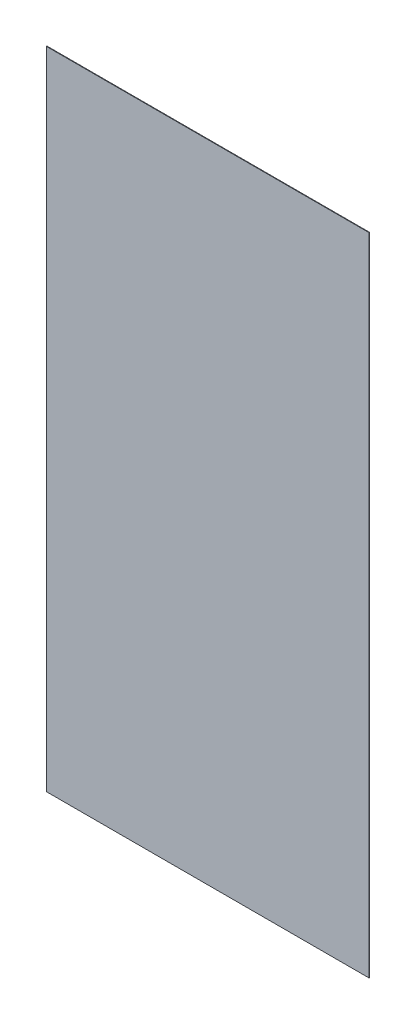
ISO-10303-21;
HEADER;
FILE_DESCRIPTION(('STEP AP214'),'2;1');
FILE_NAME('part.step','',(''),(''),'','','');
FILE_SCHEMA(('AUTOMOTIVE_DESIGN { 1 0 10303 214 1 1 1 1 }'));
ENDSEC;
DATA;
#1=APPLICATION_CONTEXT('core data for automotive mechanical design processes');
#2=APPLICATION_PROTOCOL_DEFINITION('international standard','automotive_design',2000,#1);
#3=PRODUCT_CONTEXT('',#1,'mechanical');
#4=PRODUCT('Part','Part','',(#3));
#5=PRODUCT_RELATED_PRODUCT_CATEGORY('part','',(#4));
#6=PRODUCT_DEFINITION_FORMATION('','',#4);
#7=PRODUCT_DEFINITION_CONTEXT('part definition',#1,'design');
#8=PRODUCT_DEFINITION('design','',#6,#7);
#9=PRODUCT_DEFINITION_SHAPE('','',#8);
#10=(LENGTH_UNIT() NAMED_UNIT(*) SI_UNIT(.MILLI.,.METRE.));
#11=(NAMED_UNIT(*) PLANE_ANGLE_UNIT() SI_UNIT($,.RADIAN.));
#12=(NAMED_UNIT(*) SI_UNIT($,.STERADIAN.) SOLID_ANGLE_UNIT());
#13=UNCERTAINTY_MEASURE_WITH_UNIT(LENGTH_MEASURE(1.E-05),#10,'distance_accuracy_value','');
#14=(GEOMETRIC_REPRESENTATION_CONTEXT(3) GLOBAL_UNCERTAINTY_ASSIGNED_CONTEXT((#13)) GLOBAL_UNIT_ASSIGNED_CONTEXT((#10,
#11,#12)) REPRESENTATION_CONTEXT('',''));
#15=CARTESIAN_POINT('',(0.,0.,0.));
#16=DIRECTION('',(0.,0.,1.));
#17=DIRECTION('',(1.,0.,0.));
#18=AXIS2_PLACEMENT_3D('',#15,#16,#17);
#19=CARTESIAN_POINT('',(0.,0.,1.5875));
#20=DIRECTION('',(1.,0.,0.));
#21=DIRECTION('',(0.,1.,0.));
#22=AXIS2_PLACEMENT_3D('',#19,#20,#21);
#23=PLANE('',#22);
#24=DIRECTION('',(0.,-1.,0.));
#25=VECTOR('',#24,1.);
#26=CARTESIAN_POINT('',(0.,0.,0.));
#27=LINE('',#26,#25);
#28=CARTESIAN_POINT('',(-2.22044604925031E-13,1828.8,0.));
#29=VERTEX_POINT('',#28);
#30=CARTESIAN_POINT('',(0.,0.,0.));
#31=VERTEX_POINT('',#30);
#32=EDGE_CURVE('E107',#29,#31,#27,.T.);
#33=ORIENTED_EDGE('',*,*,#32,.T.);
#34=DIRECTION('',(0.,0.,-1.));
#35=VECTOR('',#34,1.);
#36=CARTESIAN_POINT('',(0.,0.,1.5875));
#37=LINE('',#36,#35);
#38=CARTESIAN_POINT('',(0.,0.,1.5875));
#39=VERTEX_POINT('',#38);
#40=EDGE_CURVE('E11',#39,#31,#37,.T.);
#41=ORIENTED_EDGE('',*,*,#40,.F.);
#42=DIRECTION('',(0.,-1.,0.));
#43=VECTOR('',#42,1.);
#44=CARTESIAN_POINT('',(0.,0.,1.5875));
#45=LINE('',#44,#43);
#46=CARTESIAN_POINT('',(-2.22044604925031E-13,1828.8,1.5875));
#47=VERTEX_POINT('',#46);
#48=EDGE_CURVE('E91',#47,#39,#45,.T.);
#49=ORIENTED_EDGE('',*,*,#48,.F.);
#50=DIRECTION('',(0.,0.,-1.));
#51=VECTOR('',#50,1.);
#52=CARTESIAN_POINT('',(-2.22044604925031E-13,1828.8,1.5875));
#53=LINE('',#52,#51);
#54=EDGE_CURVE('E103',#47,#29,#53,.T.);
#55=ORIENTED_EDGE('',*,*,#54,.T.);
#56=EDGE_LOOP('',(#33,#41,#49,#55));
#57=FACE_BOUND('',#56,.T.);
#58=ADVANCED_FACE('F39',(#57),#23,.F.);
#59=CARTESIAN_POINT('',(0.,0.,1.5875));
#60=DIRECTION('',(0.,1.,0.));
#61=DIRECTION('',(0.,0.,1.));
#62=AXIS2_PLACEMENT_3D('',#59,#60,#61);
#63=PLANE('',#62);
#64=DIRECTION('',(1.,0.,0.));
#65=VECTOR('',#64,1.);
#66=CARTESIAN_POINT('',(0.,0.,0.));
#67=LINE('',#66,#65);
#68=CARTESIAN_POINT('',(914.4,0.,0.));
#69=VERTEX_POINT('',#68);
#70=EDGE_CURVE('E96',#31,#69,#67,.T.);
#71=ORIENTED_EDGE('',*,*,#70,.T.);
#72=DIRECTION('',(0.,0.,-1.));
#73=VECTOR('',#72,1.);
#74=CARTESIAN_POINT('',(914.4,0.,1.5875));
#75=LINE('',#74,#73);
#76=CARTESIAN_POINT('',(914.4,0.,1.5875));
#77=VERTEX_POINT('',#76);
#78=EDGE_CURVE('E48',#77,#69,#75,.T.);
#79=ORIENTED_EDGE('',*,*,#78,.F.);
#80=DIRECTION('',(1.,0.,0.));
#81=VECTOR('',#80,1.);
#82=CARTESIAN_POINT('',(0.,0.,1.5875));
#83=LINE('',#82,#81);
#84=EDGE_CURVE('E86',#39,#77,#83,.T.);
#85=ORIENTED_EDGE('',*,*,#84,.F.);
#86=ORIENTED_EDGE('',*,*,#40,.T.);
#87=EDGE_LOOP('',(#71,#79,#85,#86));
#88=FACE_BOUND('',#87,.T.);
#89=ADVANCED_FACE('F95',(#88),#63,.F.);
#90=CARTESIAN_POINT('',(914.4,0.,1.5875));
#91=DIRECTION('',(-1.,0.,0.));
#92=DIRECTION('',(0.,-1.,0.));
#93=AXIS2_PLACEMENT_3D('',#90,#91,#92);
#94=PLANE('',#93);
#95=DIRECTION('',(0.,1.,0.));
#96=VECTOR('',#95,1.);
#97=CARTESIAN_POINT('',(914.4,0.,0.));
#98=LINE('',#97,#96);
#99=CARTESIAN_POINT('',(914.4,1828.8,0.));
#100=VERTEX_POINT('',#99);
#101=EDGE_CURVE('E73',#69,#100,#98,.T.);
#102=ORIENTED_EDGE('',*,*,#101,.T.);
#103=DIRECTION('',(0.,0.,-1.));
#104=VECTOR('',#103,1.);
#105=CARTESIAN_POINT('',(914.4,1828.8,1.5875));
#106=LINE('',#105,#104);
#107=CARTESIAN_POINT('',(914.4,1828.8,1.5875));
#108=VERTEX_POINT('',#107);
#109=EDGE_CURVE('E98',#108,#100,#106,.T.);
#110=ORIENTED_EDGE('',*,*,#109,.F.);
#111=DIRECTION('',(0.,1.,0.));
#112=VECTOR('',#111,1.);
#113=CARTESIAN_POINT('',(914.4,0.,1.5875));
#114=LINE('',#113,#112);
#115=EDGE_CURVE('E89',#77,#108,#114,.T.);
#116=ORIENTED_EDGE('',*,*,#115,.F.);
#117=ORIENTED_EDGE('',*,*,#78,.T.);
#118=EDGE_LOOP('',(#102,#110,#116,#117));
#119=FACE_BOUND('',#118,.T.);
#120=ADVANCED_FACE('F99',(#119),#94,.F.);
#121=CARTESIAN_POINT('',(-2.22044604925031E-13,1828.8,1.5875));
#122=DIRECTION('',(0.,-1.,0.));
#123=DIRECTION('',(0.,0.,-1.));
#124=AXIS2_PLACEMENT_3D('',#121,#122,#123);
#125=PLANE('',#124);
#126=DIRECTION('',(-1.,0.,0.));
#127=VECTOR('',#126,1.);
#128=CARTESIAN_POINT('',(-2.22044604925031E-13,1828.8,0.));
#129=LINE('',#128,#127);
#130=EDGE_CURVE('E79',#100,#29,#129,.T.);
#131=ORIENTED_EDGE('',*,*,#130,.T.);
#132=ORIENTED_EDGE('',*,*,#54,.F.);
#133=DIRECTION('',(-1.,0.,0.));
#134=VECTOR('',#133,1.);
#135=CARTESIAN_POINT('',(-2.22044604925031E-13,1828.8,1.5875));
#136=LINE('',#135,#134);
#137=EDGE_CURVE('E56',#108,#47,#136,.T.);
#138=ORIENTED_EDGE('',*,*,#137,.F.);
#139=ORIENTED_EDGE('',*,*,#109,.T.);
#140=EDGE_LOOP('',(#131,#132,#138,#139));
#141=FACE_BOUND('',#140,.T.);
#142=ADVANCED_FACE('F120',(#141),#125,.F.);
#143=CARTESIAN_POINT('',(0.,0.,1.5875));
#144=DIRECTION('',(0.,0.,-1.));
#145=DIRECTION('',(-1.,0.,0.));
#146=AXIS2_PLACEMENT_3D('',#143,#144,#145);
#147=PLANE('',#146);
#148=ORIENTED_EDGE('',*,*,#48,.T.);
#149=ORIENTED_EDGE('',*,*,#84,.T.);
#150=ORIENTED_EDGE('',*,*,#115,.T.);
#151=ORIENTED_EDGE('',*,*,#137,.T.);
#152=EDGE_LOOP('',(#148,#149,#150,#151));
#153=FACE_BOUND('',#152,.T.);
#154=ADVANCED_FACE('F87',(#153),#147,.F.);
#155=CARTESIAN_POINT('',(0.,0.,0.));
#156=DIRECTION('',(0.,0.,-1.));
#157=DIRECTION('',(-1.,0.,0.));
#158=AXIS2_PLACEMENT_3D('',#155,#156,#157);
#159=PLANE('',#158);
#160=ORIENTED_EDGE('',*,*,#32,.F.);
#161=ORIENTED_EDGE('',*,*,#130,.F.);
#162=ORIENTED_EDGE('',*,*,#101,.F.);
#163=ORIENTED_EDGE('',*,*,#70,.F.);
#164=EDGE_LOOP('',(#160,#161,#162,#163));
#165=FACE_BOUND('',#164,.T.);
#166=ADVANCED_FACE('F123',(#165),#159,.T.);
#167=CLOSED_SHELL('',(#58,#89,#120,#142,#154,#166));
#168=MANIFOLD_SOLID_BREP('B2',#167);
#169=ADVANCED_BREP_SHAPE_REPRESENTATION('',(#18,#168),#14);
#170=SHAPE_DEFINITION_REPRESENTATION(#9,#169);
ENDSEC;
END-ISO-10303-21;
